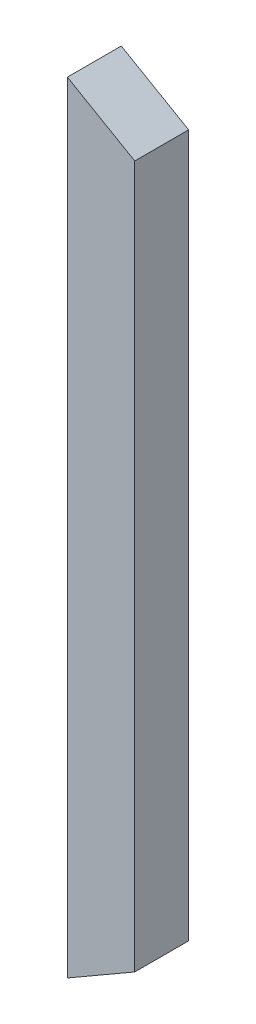
ISO-10303-21;
HEADER;
FILE_DESCRIPTION(('STEP AP214'),'2;1');
FILE_NAME('part.step','',(''),(''),'','','');
FILE_SCHEMA(('AUTOMOTIVE_DESIGN { 1 0 10303 214 1 1 1 1 }'));
ENDSEC;
DATA;
#1=APPLICATION_CONTEXT('core data for automotive mechanical design processes');
#2=APPLICATION_PROTOCOL_DEFINITION('international standard','automotive_design',2000,#1);
#3=PRODUCT_CONTEXT('',#1,'mechanical');
#4=PRODUCT('Part','Part','',(#3));
#5=PRODUCT_RELATED_PRODUCT_CATEGORY('part','',(#4));
#6=PRODUCT_DEFINITION_FORMATION('','',#4);
#7=PRODUCT_DEFINITION_CONTEXT('part definition',#1,'design');
#8=PRODUCT_DEFINITION('design','',#6,#7);
#9=PRODUCT_DEFINITION_SHAPE('','',#8);
#10=(LENGTH_UNIT() NAMED_UNIT(*) SI_UNIT(.MILLI.,.METRE.));
#11=(NAMED_UNIT(*) PLANE_ANGLE_UNIT() SI_UNIT($,.RADIAN.));
#12=(NAMED_UNIT(*) SI_UNIT($,.STERADIAN.) SOLID_ANGLE_UNIT());
#13=UNCERTAINTY_MEASURE_WITH_UNIT(LENGTH_MEASURE(1.E-05),#10,'distance_accuracy_value','');
#14=(GEOMETRIC_REPRESENTATION_CONTEXT(3) GLOBAL_UNCERTAINTY_ASSIGNED_CONTEXT((#13)) GLOBAL_UNIT_ASSIGNED_CONTEXT((#10,
#11,#12)) REPRESENTATION_CONTEXT('',''));
#15=CARTESIAN_POINT('',(0.,0.,0.));
#16=DIRECTION('',(0.,0.,1.));
#17=DIRECTION('',(1.,0.,0.));
#18=AXIS2_PLACEMENT_3D('',#15,#16,#17);
#19=CARTESIAN_POINT('',(0.,0.,40.));
#20=DIRECTION('',(1.,0.,0.));
#21=DIRECTION('',(0.,0.,-1.));
#22=AXIS2_PLACEMENT_3D('',#19,#20,#21);
#23=PLANE('',#22);
#24=DIRECTION('',(0.,-1.,0.));
#25=VECTOR('',#24,1.);
#26=CARTESIAN_POINT('',(0.,0.,0.));
#27=LINE('',#26,#25);
#28=CARTESIAN_POINT('',(0.,550.,0.));
#29=VERTEX_POINT('',#28);
#30=CARTESIAN_POINT('',(0.,-28.8675134594809,0.));
#31=VERTEX_POINT('',#30);
#32=EDGE_CURVE('E81',#29,#31,#27,.T.);
#33=ORIENTED_EDGE('',*,*,#32,.T.);
#34=DIRECTION('',(0.,0.,1.));
#35=VECTOR('',#34,1.);
#36=CARTESIAN_POINT('',(0.,-28.8675134594809,0.));
#37=LINE('',#36,#35);
#38=CARTESIAN_POINT('',(0.,-28.8675134594809,40.));
#39=VERTEX_POINT('',#38);
#40=EDGE_CURVE('E89',#31,#39,#37,.T.);
#41=ORIENTED_EDGE('',*,*,#40,.T.);
#42=DIRECTION('',(0.,-1.,0.));
#43=VECTOR('',#42,1.);
#44=CARTESIAN_POINT('',(0.,0.,40.));
#45=LINE('',#44,#43);
#46=CARTESIAN_POINT('',(0.,550.,40.));
#47=VERTEX_POINT('',#46);
#48=EDGE_CURVE('E83',#47,#39,#45,.T.);
#49=ORIENTED_EDGE('',*,*,#48,.F.);
#50=DIRECTION('',(0.,0.,-1.));
#51=VECTOR('',#50,1.);
#52=CARTESIAN_POINT('',(0.,550.,40.));
#53=LINE('',#52,#51);
#54=EDGE_CURVE('E40',#47,#29,#53,.T.);
#55=ORIENTED_EDGE('',*,*,#54,.T.);
#56=EDGE_LOOP('',(#33,#41,#49,#55));
#57=FACE_BOUND('',#56,.T.);
#58=ADVANCED_FACE('F33',(#57),#23,.F.);
#59=CARTESIAN_POINT('',(50.,0.,40.));
#60=DIRECTION('',(-1.,0.,0.));
#61=DIRECTION('',(0.,0.,1.));
#62=AXIS2_PLACEMENT_3D('',#59,#60,#61);
#63=PLANE('',#62);
#64=DIRECTION('',(0.,1.,0.));
#65=VECTOR('',#64,1.);
#66=CARTESIAN_POINT('',(50.,0.,0.));
#67=LINE('',#66,#65);
#68=CARTESIAN_POINT('',(50.,0.,0.));
#69=VERTEX_POINT('',#68);
#70=CARTESIAN_POINT('',(50.,521.132486540519,0.));
#71=VERTEX_POINT('',#70);
#72=EDGE_CURVE('E88',#69,#71,#67,.T.);
#73=ORIENTED_EDGE('',*,*,#72,.T.);
#74=DIRECTION('',(0.,0.,1.));
#75=VECTOR('',#74,1.);
#76=CARTESIAN_POINT('',(50.,521.132486540519,0.));
#77=LINE('',#76,#75);
#78=CARTESIAN_POINT('',(50.,521.132486540519,40.));
#79=VERTEX_POINT('',#78);
#80=EDGE_CURVE('E47',#71,#79,#77,.T.);
#81=ORIENTED_EDGE('',*,*,#80,.T.);
#82=DIRECTION('',(0.,1.,0.));
#83=VECTOR('',#82,1.);
#84=CARTESIAN_POINT('',(50.,0.,40.));
#85=LINE('',#84,#83);
#86=CARTESIAN_POINT('',(50.,0.,40.));
#87=VERTEX_POINT('',#86);
#88=EDGE_CURVE('E54',#87,#79,#85,.T.);
#89=ORIENTED_EDGE('',*,*,#88,.F.);
#90=DIRECTION('',(0.,0.,-1.));
#91=VECTOR('',#90,1.);
#92=CARTESIAN_POINT('',(50.,0.,40.));
#93=LINE('',#92,#91);
#94=EDGE_CURVE('E11',#87,#69,#93,.T.);
#95=ORIENTED_EDGE('',*,*,#94,.T.);
#96=EDGE_LOOP('',(#73,#81,#89,#95));
#97=FACE_BOUND('',#96,.T.);
#98=ADVANCED_FACE('F102',(#97),#63,.F.);
#99=CARTESIAN_POINT('',(0.,0.,40.));
#100=DIRECTION('',(0.,0.,-1.));
#101=DIRECTION('',(-1.,0.,0.));
#102=AXIS2_PLACEMENT_3D('',#99,#100,#101);
#103=PLANE('',#102);
#104=ORIENTED_EDGE('',*,*,#88,.T.);
#105=DIRECTION('',(-0.866025403784442,0.499999999999995,0.));
#106=VECTOR('',#105,1.);
#107=CARTESIAN_POINT('',(238.156986040719,412.500000000003,40.));
#108=LINE('',#107,#106);
#109=EDGE_CURVE('E99',#79,#47,#108,.T.);
#110=ORIENTED_EDGE('',*,*,#109,.T.);
#111=ORIENTED_EDGE('',*,*,#48,.T.);
#112=DIRECTION('',(0.866025403784441,0.499999999999995,0.));
#113=VECTOR('',#112,1.);
#114=CARTESIAN_POINT('',(0.,-28.8675134594809,40.));
#115=LINE('',#114,#113);
#116=EDGE_CURVE('E96',#39,#87,#115,.T.);
#117=ORIENTED_EDGE('',*,*,#116,.T.);
#118=EDGE_LOOP('',(#104,#110,#111,#117));
#119=FACE_BOUND('',#118,.T.);
#120=ADVANCED_FACE('F104',(#119),#103,.F.);
#121=CARTESIAN_POINT('',(0.,0.,0.));
#122=DIRECTION('',(0.,0.,-1.));
#123=DIRECTION('',(-1.,0.,0.));
#124=AXIS2_PLACEMENT_3D('',#121,#122,#123);
#125=PLANE('',#124);
#126=DIRECTION('',(0.866025403784442,-0.499999999999995,0.));
#127=VECTOR('',#126,1.);
#128=CARTESIAN_POINT('',(50.,521.132486540519,0.));
#129=LINE('',#128,#127);
#130=EDGE_CURVE('E69',#29,#71,#129,.T.);
#131=ORIENTED_EDGE('',*,*,#130,.T.);
#132=ORIENTED_EDGE('',*,*,#72,.F.);
#133=DIRECTION('',(0.866025403784441,0.499999999999995,0.));
#134=VECTOR('',#133,1.);
#135=CARTESIAN_POINT('',(0.,-28.8675134594809,0.));
#136=LINE('',#135,#134);
#137=EDGE_CURVE('E87',#31,#69,#136,.T.);
#138=ORIENTED_EDGE('',*,*,#137,.F.);
#139=ORIENTED_EDGE('',*,*,#32,.F.);
#140=EDGE_LOOP('',(#131,#132,#138,#139));
#141=FACE_BOUND('',#140,.T.);
#142=ADVANCED_FACE('F85',(#141),#125,.T.);
#143=CARTESIAN_POINT('',(0.,-28.8675134594809,0.));
#144=DIRECTION('',(0.499999999999995,-0.866025403784441,0.));
#145=DIRECTION('',(0.866025403784441,0.499999999999995,0.));
#146=AXIS2_PLACEMENT_3D('',#143,#144,#145);
#147=PLANE('',#146);
#148=ORIENTED_EDGE('',*,*,#116,.F.);
#149=ORIENTED_EDGE('',*,*,#40,.F.);
#150=ORIENTED_EDGE('',*,*,#137,.T.);
#151=ORIENTED_EDGE('',*,*,#94,.F.);
#152=EDGE_LOOP('',(#148,#149,#150,#151));
#153=FACE_BOUND('',#152,.T.);
#154=ADVANCED_FACE('F107',(#153),#147,.T.);
#155=CARTESIAN_POINT('',(50.,521.132486540519,0.));
#156=DIRECTION('',(-0.499999999999995,-0.866025403784442,0.));
#157=DIRECTION('',(0.866025403784442,-0.499999999999995,0.));
#158=AXIS2_PLACEMENT_3D('',#155,#156,#157);
#159=PLANE('',#158);
#160=ORIENTED_EDGE('',*,*,#80,.F.);
#161=ORIENTED_EDGE('',*,*,#130,.F.);
#162=ORIENTED_EDGE('',*,*,#54,.F.);
#163=ORIENTED_EDGE('',*,*,#109,.F.);
#164=EDGE_LOOP('',(#160,#161,#162,#163));
#165=FACE_BOUND('',#164,.T.);
#166=ADVANCED_FACE('F71',(#165),#159,.F.);
#167=CLOSED_SHELL('',(#58,#98,#120,#142,#154,#166));
#168=MANIFOLD_SOLID_BREP('B2',#167);
#169=ADVANCED_BREP_SHAPE_REPRESENTATION('',(#18,#168),#14);
#170=SHAPE_DEFINITION_REPRESENTATION(#9,#169);
ENDSEC;
END-ISO-10303-21;
